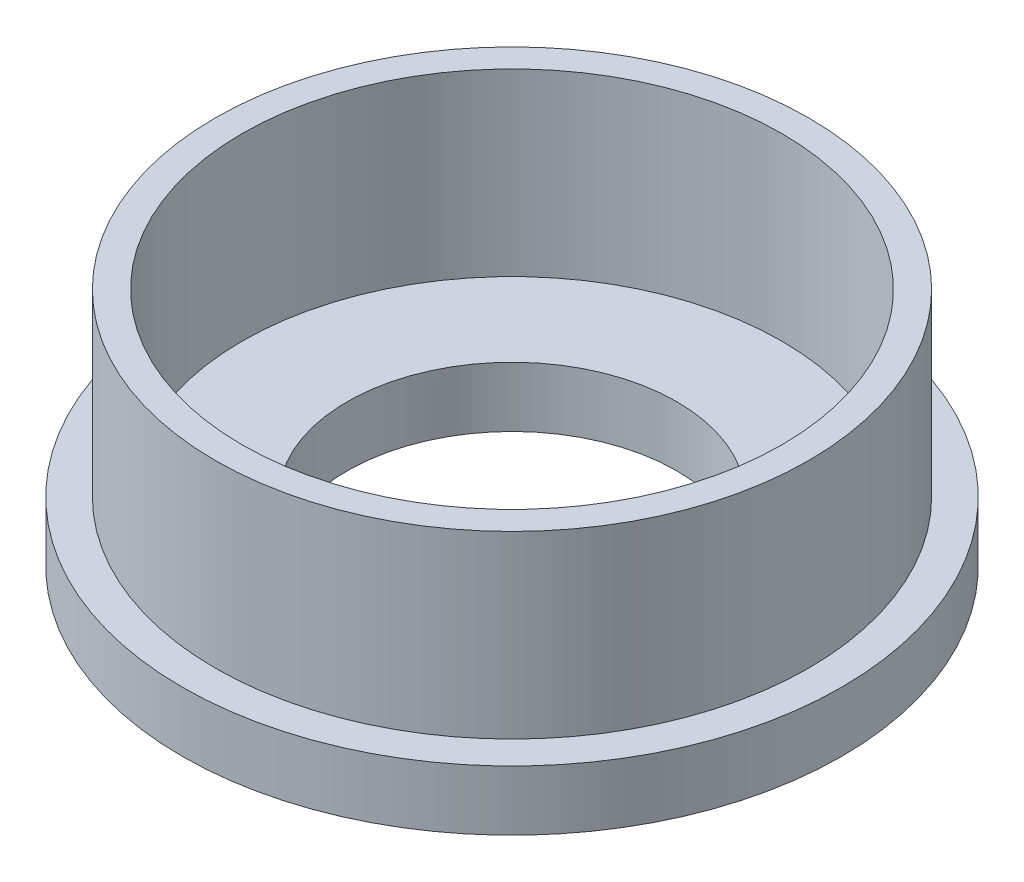
ISO-10303-21;
HEADER;
FILE_DESCRIPTION(('STEP AP214'),'2;1');
FILE_NAME('part.step','',(''),(''),'','','');
FILE_SCHEMA(('AUTOMOTIVE_DESIGN { 1 0 10303 214 1 1 1 1 }'));
ENDSEC;
DATA;
#1=APPLICATION_CONTEXT('core data for automotive mechanical design processes');
#2=APPLICATION_PROTOCOL_DEFINITION('international standard','automotive_design',2000,#1);
#3=PRODUCT_CONTEXT('',#1,'mechanical');
#4=PRODUCT('Part','Part','',(#3));
#5=PRODUCT_RELATED_PRODUCT_CATEGORY('part','',(#4));
#6=PRODUCT_DEFINITION_FORMATION('','',#4);
#7=PRODUCT_DEFINITION_CONTEXT('part definition',#1,'design');
#8=PRODUCT_DEFINITION('design','',#6,#7);
#9=PRODUCT_DEFINITION_SHAPE('','',#8);
#10=(LENGTH_UNIT() NAMED_UNIT(*) SI_UNIT(.MILLI.,.METRE.));
#11=(NAMED_UNIT(*) PLANE_ANGLE_UNIT() SI_UNIT($,.RADIAN.));
#12=(NAMED_UNIT(*) SI_UNIT($,.STERADIAN.) SOLID_ANGLE_UNIT());
#13=UNCERTAINTY_MEASURE_WITH_UNIT(LENGTH_MEASURE(1.E-05),#10,'distance_accuracy_value','');
#14=(GEOMETRIC_REPRESENTATION_CONTEXT(3) GLOBAL_UNCERTAINTY_ASSIGNED_CONTEXT((#13)) GLOBAL_UNIT_ASSIGNED_CONTEXT((#10,
#11,#12)) REPRESENTATION_CONTEXT('',''));
#15=CARTESIAN_POINT('',(0.,0.,0.));
#16=DIRECTION('',(0.,0.,1.));
#17=DIRECTION('',(1.,0.,0.));
#18=AXIS2_PLACEMENT_3D('',#15,#16,#17);
#19=CARTESIAN_POINT('',(0.,10.,0.));
#20=DIRECTION('',(0.,1.,0.));
#21=DIRECTION('',(0.,0.,1.));
#22=AXIS2_PLACEMENT_3D('',#19,#20,#21);
#23=PLANE('',#22);
#24=CARTESIAN_POINT('',(0.,10.,0.));
#25=DIRECTION('',(0.,1.,0.));
#26=DIRECTION('',(0.,0.,1.));
#27=AXIS2_PLACEMENT_3D('',#24,#25,#26);
#28=CIRCLE('',#27,55.);
#29=CARTESIAN_POINT('',(0.,10.,55.));
#30=VERTEX_POINT('',#29);
#31=EDGE_CURVE('E36',#30,#30,#28,.T.);
#32=ORIENTED_EDGE('',*,*,#31,.T.);
#33=EDGE_LOOP('',(#32));
#34=FACE_BOUND('',#33,.T.);
#35=CARTESIAN_POINT('',(0.,10.,0.));
#36=DIRECTION('',(0.,1.,0.));
#37=DIRECTION('',(0.,0.,1.));
#38=AXIS2_PLACEMENT_3D('',#35,#36,#37);
#39=CIRCLE('',#38,49.5);
#40=CARTESIAN_POINT('',(0.,10.,49.5));
#41=VERTEX_POINT('',#40);
#42=EDGE_CURVE('E46',#41,#41,#39,.T.);
#43=ORIENTED_EDGE('',*,*,#42,.F.);
#44=EDGE_LOOP('',(#43));
#45=FACE_BOUND('',#44,.T.);
#46=ADVANCED_FACE('F28',(#34,#45),#23,.T.);
#47=CARTESIAN_POINT('',(0.,10.,0.));
#48=DIRECTION('',(0.,-1.,0.));
#49=DIRECTION('',(0.,0.,-1.));
#50=AXIS2_PLACEMENT_3D('',#47,#48,#49);
#51=CYLINDRICAL_SURFACE('',#50,55.);
#52=ORIENTED_EDGE('',*,*,#31,.F.);
#53=EDGE_LOOP('',(#52));
#54=FACE_BOUND('',#53,.T.);
#55=CARTESIAN_POINT('',(0.,0.,0.));
#56=DIRECTION('',(0.,1.,0.));
#57=DIRECTION('',(0.,0.,1.));
#58=AXIS2_PLACEMENT_3D('',#55,#56,#57);
#59=CIRCLE('',#58,55.);
#60=CARTESIAN_POINT('',(0.,0.,55.));
#61=VERTEX_POINT('',#60);
#62=EDGE_CURVE('E40',#61,#61,#59,.T.);
#63=ORIENTED_EDGE('',*,*,#62,.T.);
#64=EDGE_LOOP('',(#63));
#65=FACE_BOUND('',#64,.T.);
#66=ADVANCED_FACE('F30',(#54,#65),#51,.T.);
#67=CARTESIAN_POINT('',(0.,0.,0.));
#68=DIRECTION('',(0.,1.,0.));
#69=DIRECTION('',(0.,0.,1.));
#70=AXIS2_PLACEMENT_3D('',#67,#68,#69);
#71=PLANE('',#70);
#72=CARTESIAN_POINT('',(0.,0.,0.));
#73=DIRECTION('',(0.,-1.,0.));
#74=DIRECTION('',(0.,0.,-1.));
#75=AXIS2_PLACEMENT_3D('',#72,#73,#74);
#76=CIRCLE('',#75,27.5);
#77=CARTESIAN_POINT('',(0.,0.,-27.5));
#78=VERTEX_POINT('',#77);
#79=EDGE_CURVE('E54',#78,#78,#76,.T.);
#80=ORIENTED_EDGE('',*,*,#79,.F.);
#81=EDGE_LOOP('',(#80));
#82=FACE_BOUND('',#81,.T.);
#83=ORIENTED_EDGE('',*,*,#62,.F.);
#84=EDGE_LOOP('',(#83));
#85=FACE_BOUND('',#84,.T.);
#86=ADVANCED_FACE('F82',(#82,#85),#71,.F.);
#87=CARTESIAN_POINT('',(0.,40.,0.));
#88=DIRECTION('',(0.,1.,0.));
#89=DIRECTION('',(0.,0.,1.));
#90=AXIS2_PLACEMENT_3D('',#87,#88,#89);
#91=PLANE('',#90);
#92=CARTESIAN_POINT('',(0.,40.,0.));
#93=DIRECTION('',(0.,1.,0.));
#94=DIRECTION('',(0.,0.,1.));
#95=AXIS2_PLACEMENT_3D('',#92,#93,#94);
#96=CIRCLE('',#95,49.5);
#97=CARTESIAN_POINT('',(0.,40.,49.5));
#98=VERTEX_POINT('',#97);
#99=EDGE_CURVE('E44',#98,#98,#96,.T.);
#100=ORIENTED_EDGE('',*,*,#99,.T.);
#101=EDGE_LOOP('',(#100));
#102=FACE_BOUND('',#101,.T.);
#103=CARTESIAN_POINT('',(0.,40.,0.));
#104=DIRECTION('',(0.,1.,0.));
#105=DIRECTION('',(0.,0.,1.));
#106=AXIS2_PLACEMENT_3D('',#103,#104,#105);
#107=CIRCLE('',#106,45.);
#108=CARTESIAN_POINT('',(0.,40.,45.));
#109=VERTEX_POINT('',#108);
#110=EDGE_CURVE('E49',#109,#109,#107,.T.);
#111=ORIENTED_EDGE('',*,*,#110,.F.);
#112=EDGE_LOOP('',(#111));
#113=FACE_BOUND('',#112,.T.);
#114=ADVANCED_FACE('F89',(#102,#113),#91,.T.);
#115=CARTESIAN_POINT('',(0.,40.,0.));
#116=DIRECTION('',(0.,-1.,0.));
#117=DIRECTION('',(0.,0.,-1.));
#118=AXIS2_PLACEMENT_3D('',#115,#116,#117);
#119=CYLINDRICAL_SURFACE('',#118,49.5);
#120=ORIENTED_EDGE('',*,*,#99,.F.);
#121=EDGE_LOOP('',(#120));
#122=FACE_BOUND('',#121,.T.);
#123=ORIENTED_EDGE('',*,*,#42,.T.);
#124=EDGE_LOOP('',(#123));
#125=FACE_BOUND('',#124,.T.);
#126=ADVANCED_FACE('F73',(#122,#125),#119,.T.);
#127=CARTESIAN_POINT('',(0.,40.,0.));
#128=DIRECTION('',(0.,-1.,0.));
#129=DIRECTION('',(0.,0.,-1.));
#130=AXIS2_PLACEMENT_3D('',#127,#128,#129);
#131=CYLINDRICAL_SURFACE('',#130,45.);
#132=ORIENTED_EDGE('',*,*,#110,.T.);
#133=EDGE_LOOP('',(#132));
#134=FACE_BOUND('',#133,.T.);
#135=CARTESIAN_POINT('',(0.,10.,0.));
#136=DIRECTION('',(0.,1.,0.));
#137=DIRECTION('',(0.,0.,1.));
#138=AXIS2_PLACEMENT_3D('',#135,#136,#137);
#139=CIRCLE('',#138,45.);
#140=CARTESIAN_POINT('',(0.,10.,45.));
#141=VERTEX_POINT('',#140);
#142=EDGE_CURVE('E10',#141,#141,#139,.F.);
#143=ORIENTED_EDGE('',*,*,#142,.T.);
#144=EDGE_LOOP('',(#143));
#145=FACE_BOUND('',#144,.T.);
#146=ADVANCED_FACE('F66',(#134,#145),#131,.F.);
#147=CARTESIAN_POINT('',(0.,10.,0.));
#148=DIRECTION('',(0.,1.,0.));
#149=DIRECTION('',(0.,0.,1.));
#150=AXIS2_PLACEMENT_3D('',#147,#148,#149);
#151=CIRCLE('',#150,27.5);
#152=CARTESIAN_POINT('',(0.,10.,27.5));
#153=VERTEX_POINT('',#152);
#154=EDGE_CURVE('E32',#153,#153,#151,.T.);
#155=ORIENTED_EDGE('',*,*,#154,.F.);
#156=EDGE_LOOP('',(#155));
#157=FACE_BOUND('',#156,.T.);
#158=ORIENTED_EDGE('',*,*,#142,.F.);
#159=EDGE_LOOP('',(#158));
#160=FACE_BOUND('',#159,.T.);
#161=ADVANCED_FACE('F63',(#157,#160),#23,.T.);
#162=CARTESIAN_POINT('',(0.,40.,0.));
#163=DIRECTION('',(0.,-1.,0.));
#164=DIRECTION('',(0.,0.,-1.));
#165=AXIS2_PLACEMENT_3D('',#162,#163,#164);
#166=CYLINDRICAL_SURFACE('',#165,27.5);
#167=ORIENTED_EDGE('',*,*,#154,.T.);
#168=EDGE_LOOP('',(#167));
#169=FACE_BOUND('',#168,.T.);
#170=ORIENTED_EDGE('',*,*,#79,.T.);
#171=EDGE_LOOP('',(#170));
#172=FACE_BOUND('',#171,.T.);
#173=ADVANCED_FACE('F61',(#169,#172),#166,.F.);
#174=CLOSED_SHELL('',(#46,#66,#86,#114,#126,#146,#161,#173));
#175=MANIFOLD_SOLID_BREP('B2',#174);
#176=ADVANCED_BREP_SHAPE_REPRESENTATION('',(#18,#175),#14);
#177=SHAPE_DEFINITION_REPRESENTATION(#9,#176);
ENDSEC;
END-ISO-10303-21;
